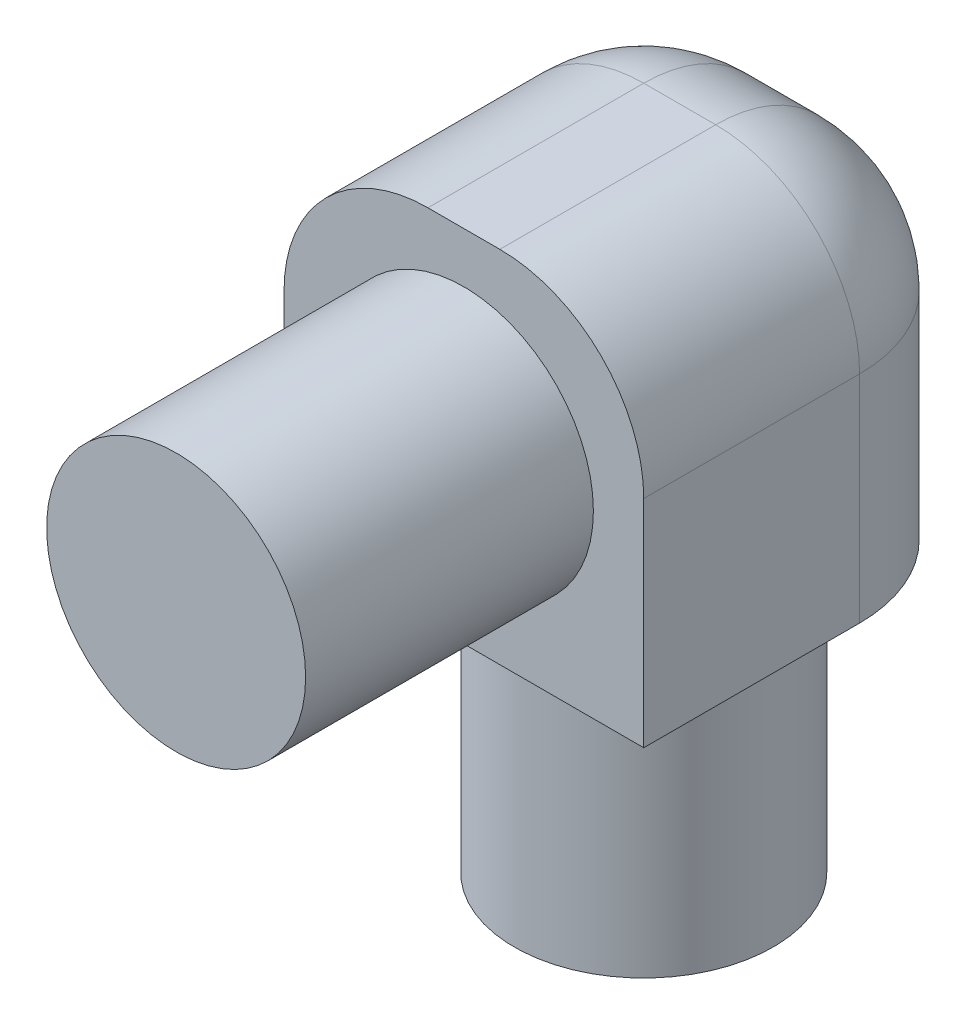
ISO-10303-21;
HEADER;
FILE_DESCRIPTION(('STEP AP214'),'2;1');
FILE_NAME('part.step','',(''),(''),'','','');
FILE_SCHEMA(('AUTOMOTIVE_DESIGN { 1 0 10303 214 1 1 1 1 }'));
ENDSEC;
DATA;
#1=APPLICATION_CONTEXT('core data for automotive mechanical design processes');
#2=APPLICATION_PROTOCOL_DEFINITION('international standard','automotive_design',2000,#1);
#3=PRODUCT_CONTEXT('',#1,'mechanical');
#4=PRODUCT('Part','Part','',(#3));
#5=PRODUCT_RELATED_PRODUCT_CATEGORY('part','',(#4));
#6=PRODUCT_DEFINITION_FORMATION('','',#4);
#7=PRODUCT_DEFINITION_CONTEXT('part definition',#1,'design');
#8=PRODUCT_DEFINITION('design','',#6,#7);
#9=PRODUCT_DEFINITION_SHAPE('','',#8);
#10=(LENGTH_UNIT() NAMED_UNIT(*) SI_UNIT(.MILLI.,.METRE.));
#11=(NAMED_UNIT(*) PLANE_ANGLE_UNIT() SI_UNIT($,.RADIAN.));
#12=(NAMED_UNIT(*) SI_UNIT($,.STERADIAN.) SOLID_ANGLE_UNIT());
#13=UNCERTAINTY_MEASURE_WITH_UNIT(LENGTH_MEASURE(1.E-05),#10,'distance_accuracy_value','');
#14=(GEOMETRIC_REPRESENTATION_CONTEXT(3) GLOBAL_UNCERTAINTY_ASSIGNED_CONTEXT((#13)) GLOBAL_UNIT_ASSIGNED_CONTEXT((#10,
#11,#12)) REPRESENTATION_CONTEXT('',''));
#15=CARTESIAN_POINT('',(0.,0.,0.));
#16=DIRECTION('',(0.,0.,1.));
#17=DIRECTION('',(1.,0.,0.));
#18=AXIS2_PLACEMENT_3D('',#15,#16,#17);
#19=CARTESIAN_POINT('',(-25.,50.,-25.));
#20=DIRECTION('',(1.,0.,0.));
#21=DIRECTION('',(0.,0.,-1.));
#22=AXIS2_PLACEMENT_3D('',#19,#20,#21);
#23=PLANE('',#22);
#24=DIRECTION('',(0.,0.,1.));
#25=VECTOR('',#24,1.);
#26=CARTESIAN_POINT('',(-25.,30.,-25.));
#27=LINE('',#26,#25);
#28=CARTESIAN_POINT('',(-25.,30.,25.));
#29=VERTEX_POINT('',#28);
#30=CARTESIAN_POINT('',(-25.,30.,-5.));
#31=VERTEX_POINT('',#30);
#32=EDGE_CURVE('E49',#29,#31,#27,.F.);
#33=ORIENTED_EDGE('',*,*,#32,.T.);
#34=DIRECTION('',(0.,-1.,0.));
#35=VECTOR('',#34,1.);
#36=CARTESIAN_POINT('',(-25.,50.,-5.));
#37=LINE('',#36,#35);
#38=CARTESIAN_POINT('',(-25.,0.,-5.));
#39=VERTEX_POINT('',#38);
#40=EDGE_CURVE('E11',#31,#39,#37,.T.);
#41=ORIENTED_EDGE('',*,*,#40,.T.);
#42=DIRECTION('',(0.,0.,1.));
#43=VECTOR('',#42,1.);
#44=CARTESIAN_POINT('',(-25.,0.,-25.));
#45=LINE('',#44,#43);
#46=CARTESIAN_POINT('',(-25.,0.,25.));
#47=VERTEX_POINT('',#46);
#48=EDGE_CURVE('E116',#39,#47,#45,.T.);
#49=ORIENTED_EDGE('',*,*,#48,.T.);
#50=DIRECTION('',(0.,-1.,0.));
#51=VECTOR('',#50,1.);
#52=CARTESIAN_POINT('',(-25.,50.,25.));
#53=LINE('',#52,#51);
#54=EDGE_CURVE('E104',#29,#47,#53,.T.);
#55=ORIENTED_EDGE('',*,*,#54,.F.);
#56=EDGE_LOOP('',(#33,#41,#49,#55));
#57=FACE_BOUND('',#56,.T.);
#58=ADVANCED_FACE('F39',(#57),#23,.F.);
#59=CARTESIAN_POINT('',(-25.,50.,25.));
#60=DIRECTION('',(0.,0.,-1.));
#61=DIRECTION('',(-1.,0.,0.));
#62=AXIS2_PLACEMENT_3D('',#59,#60,#61);
#63=PLANE('',#62);
#64=CARTESIAN_POINT('',(0.,25.,25.));
#65=DIRECTION('',(0.,0.,1.));
#66=DIRECTION('',(1.,0.,0.));
#67=AXIS2_PLACEMENT_3D('',#64,#65,#66);
#68=CIRCLE('',#67,18.);
#69=CARTESIAN_POINT('',(18.,25.,25.));
#70=VERTEX_POINT('',#69);
#71=EDGE_CURVE('E112',#70,#70,#68,.T.);
#72=ORIENTED_EDGE('',*,*,#71,.F.);
#73=EDGE_LOOP('',(#72));
#74=FACE_BOUND('',#73,.T.);
#75=DIRECTION('',(0.,-1.,0.));
#76=VECTOR('',#75,1.);
#77=CARTESIAN_POINT('',(25.,50.,25.));
#78=LINE('',#77,#76);
#79=CARTESIAN_POINT('',(25.,30.,25.));
#80=VERTEX_POINT('',#79);
#81=CARTESIAN_POINT('',(25.,0.,25.));
#82=VERTEX_POINT('',#81);
#83=EDGE_CURVE('E113',#80,#82,#78,.T.);
#84=ORIENTED_EDGE('',*,*,#83,.F.);
#85=CARTESIAN_POINT('',(5.,30.,25.));
#86=DIRECTION('',(0.,0.,-1.));
#87=DIRECTION('',(-1.,0.,0.));
#88=AXIS2_PLACEMENT_3D('',#85,#86,#87);
#89=CIRCLE('',#88,20.);
#90=CARTESIAN_POINT('',(5.,50.,25.));
#91=VERTEX_POINT('',#90);
#92=EDGE_CURVE('E173',#80,#91,#89,.F.);
#93=ORIENTED_EDGE('',*,*,#92,.T.);
#94=DIRECTION('',(1.,0.,0.));
#95=VECTOR('',#94,1.);
#96=CARTESIAN_POINT('',(-25.,50.,25.));
#97=LINE('',#96,#95);
#98=CARTESIAN_POINT('',(-5.,50.,25.));
#99=VERTEX_POINT('',#98);
#100=EDGE_CURVE('E136',#99,#91,#97,.T.);
#101=ORIENTED_EDGE('',*,*,#100,.F.);
#102=CARTESIAN_POINT('',(-5.,30.,25.));
#103=DIRECTION('',(0.,0.,-1.));
#104=DIRECTION('',(-1.,0.,0.));
#105=AXIS2_PLACEMENT_3D('',#102,#103,#104);
#106=CIRCLE('',#105,20.);
#107=EDGE_CURVE('E63',#99,#29,#106,.F.);
#108=ORIENTED_EDGE('',*,*,#107,.T.);
#109=ORIENTED_EDGE('',*,*,#54,.T.);
#110=DIRECTION('',(1.,0.,0.));
#111=VECTOR('',#110,1.);
#112=CARTESIAN_POINT('',(-25.,0.,25.));
#113=LINE('',#112,#111);
#114=EDGE_CURVE('E109',#47,#82,#113,.T.);
#115=ORIENTED_EDGE('',*,*,#114,.T.);
#116=EDGE_LOOP('',(#84,#93,#101,#108,#109,#115));
#117=FACE_BOUND('',#116,.T.);
#118=ADVANCED_FACE('F107',(#74,#117),#63,.F.);
#119=CARTESIAN_POINT('',(25.,50.,-25.));
#120=DIRECTION('',(-1.,0.,0.));
#121=DIRECTION('',(0.,0.,1.));
#122=AXIS2_PLACEMENT_3D('',#119,#120,#121);
#123=PLANE('',#122);
#124=DIRECTION('',(0.,0.,-1.));
#125=VECTOR('',#124,1.);
#126=CARTESIAN_POINT('',(25.,0.,-25.));
#127=LINE('',#126,#125);
#128=CARTESIAN_POINT('',(25.,0.,-5.));
#129=VERTEX_POINT('',#128);
#130=EDGE_CURVE('E125',#82,#129,#127,.T.);
#131=ORIENTED_EDGE('',*,*,#130,.T.);
#132=DIRECTION('',(0.,-1.,0.));
#133=VECTOR('',#132,1.);
#134=CARTESIAN_POINT('',(25.,50.,-5.));
#135=LINE('',#134,#133);
#136=CARTESIAN_POINT('',(25.,30.,-5.));
#137=VERTEX_POINT('',#136);
#138=EDGE_CURVE('E168',#129,#137,#135,.F.);
#139=ORIENTED_EDGE('',*,*,#138,.T.);
#140=DIRECTION('',(0.,0.,-1.));
#141=VECTOR('',#140,1.);
#142=CARTESIAN_POINT('',(25.,30.,25.));
#143=LINE('',#142,#141);
#144=EDGE_CURVE('E165',#137,#80,#143,.F.);
#145=ORIENTED_EDGE('',*,*,#144,.T.);
#146=ORIENTED_EDGE('',*,*,#83,.T.);
#147=EDGE_LOOP('',(#131,#139,#145,#146));
#148=FACE_BOUND('',#147,.T.);
#149=ADVANCED_FACE('F252',(#148),#123,.F.);
#150=CARTESIAN_POINT('',(-25.,50.,-25.));
#151=DIRECTION('',(0.,0.,1.));
#152=DIRECTION('',(1.,0.,0.));
#153=AXIS2_PLACEMENT_3D('',#150,#151,#152);
#154=PLANE('',#153);
#155=DIRECTION('',(-1.,0.,0.));
#156=VECTOR('',#155,1.);
#157=CARTESIAN_POINT('',(25.,30.,-25.));
#158=LINE('',#157,#156);
#159=CARTESIAN_POINT('',(-5.,30.,-25.));
#160=VERTEX_POINT('',#159);
#161=CARTESIAN_POINT('',(5.,30.,-25.));
#162=VERTEX_POINT('',#161);
#163=EDGE_CURVE('E153',#160,#162,#158,.F.);
#164=ORIENTED_EDGE('',*,*,#163,.T.);
#165=DIRECTION('',(0.,-1.,0.));
#166=VECTOR('',#165,1.);
#167=CARTESIAN_POINT('',(5.,50.,-25.));
#168=LINE('',#167,#166);
#169=CARTESIAN_POINT('',(5.,0.,-25.));
#170=VERTEX_POINT('',#169);
#171=EDGE_CURVE('E156',#162,#170,#168,.T.);
#172=ORIENTED_EDGE('',*,*,#171,.T.);
#173=DIRECTION('',(-1.,0.,0.));
#174=VECTOR('',#173,1.);
#175=CARTESIAN_POINT('',(-25.,0.,-25.));
#176=LINE('',#175,#174);
#177=CARTESIAN_POINT('',(-5.,0.,-25.));
#178=VERTEX_POINT('',#177);
#179=EDGE_CURVE('E129',#170,#178,#176,.T.);
#180=ORIENTED_EDGE('',*,*,#179,.T.);
#181=DIRECTION('',(0.,-1.,0.));
#182=VECTOR('',#181,1.);
#183=CARTESIAN_POINT('',(-5.,50.,-25.));
#184=LINE('',#183,#182);
#185=EDGE_CURVE('E150',#178,#160,#184,.F.);
#186=ORIENTED_EDGE('',*,*,#185,.T.);
#187=EDGE_LOOP('',(#164,#172,#180,#186));
#188=FACE_BOUND('',#187,.T.);
#189=ADVANCED_FACE('F351',(#188),#154,.F.);
#190=CARTESIAN_POINT('',(0.,50.,0.));
#191=DIRECTION('',(0.,1.,0.));
#192=DIRECTION('',(0.,0.,1.));
#193=AXIS2_PLACEMENT_3D('',#190,#191,#192);
#194=PLANE('',#193);
#195=ORIENTED_EDGE('',*,*,#100,.T.);
#196=DIRECTION('',(0.,0.,-1.));
#197=VECTOR('',#196,1.);
#198=CARTESIAN_POINT('',(5.,50.,-25.));
#199=LINE('',#198,#197);
#200=CARTESIAN_POINT('',(5.,50.,-5.));
#201=VERTEX_POINT('',#200);
#202=EDGE_CURVE('E147',#91,#201,#199,.T.);
#203=ORIENTED_EDGE('',*,*,#202,.T.);
#204=DIRECTION('',(-1.,0.,0.));
#205=VECTOR('',#204,1.);
#206=CARTESIAN_POINT('',(-25.,50.,-5.));
#207=LINE('',#206,#205);
#208=CARTESIAN_POINT('',(-5.,50.,-5.));
#209=VERTEX_POINT('',#208);
#210=EDGE_CURVE('E142',#201,#209,#207,.T.);
#211=ORIENTED_EDGE('',*,*,#210,.T.);
#212=DIRECTION('',(0.,0.,1.));
#213=VECTOR('',#212,1.);
#214=CARTESIAN_POINT('',(-5.,50.,25.));
#215=LINE('',#214,#213);
#216=EDGE_CURVE('E139',#209,#99,#215,.T.);
#217=ORIENTED_EDGE('',*,*,#216,.T.);
#218=EDGE_LOOP('',(#195,#203,#211,#217));
#219=FACE_BOUND('',#218,.T.);
#220=ADVANCED_FACE('F220',(#219),#194,.T.);
#221=CARTESIAN_POINT('',(0.,0.,0.));
#222=DIRECTION('',(0.,1.,0.));
#223=DIRECTION('',(0.,0.,1.));
#224=AXIS2_PLACEMENT_3D('',#221,#222,#223);
#225=PLANE('',#224);
#226=CARTESIAN_POINT('',(0.,0.,0.));
#227=DIRECTION('',(0.,-1.,0.));
#228=DIRECTION('',(0.,0.,-1.));
#229=AXIS2_PLACEMENT_3D('',#226,#227,#228);
#230=CIRCLE('',#229,18.);
#231=CARTESIAN_POINT('',(0.,0.,-18.));
#232=VERTEX_POINT('',#231);
#233=EDGE_CURVE('E143',#232,#232,#230,.T.);
#234=ORIENTED_EDGE('',*,*,#233,.F.);
#235=EDGE_LOOP('',(#234));
#236=FACE_BOUND('',#235,.T.);
#237=ORIENTED_EDGE('',*,*,#179,.F.);
#238=CARTESIAN_POINT('',(5.,0.,-5.));
#239=DIRECTION('',(0.,1.,0.));
#240=DIRECTION('',(0.,0.,1.));
#241=AXIS2_PLACEMENT_3D('',#238,#239,#240);
#242=CIRCLE('',#241,20.);
#243=EDGE_CURVE('E162',#170,#129,#242,.F.);
#244=ORIENTED_EDGE('',*,*,#243,.T.);
#245=ORIENTED_EDGE('',*,*,#130,.F.);
#246=ORIENTED_EDGE('',*,*,#114,.F.);
#247=ORIENTED_EDGE('',*,*,#48,.F.);
#248=CARTESIAN_POINT('',(-5.,0.,-5.));
#249=DIRECTION('',(0.,1.,0.));
#250=DIRECTION('',(0.,0.,1.));
#251=AXIS2_PLACEMENT_3D('',#248,#249,#250);
#252=CIRCLE('',#251,20.);
#253=EDGE_CURVE('E159',#39,#178,#252,.F.);
#254=ORIENTED_EDGE('',*,*,#253,.T.);
#255=EDGE_LOOP('',(#237,#244,#245,#246,#247,#254));
#256=FACE_BOUND('',#255,.T.);
#257=ADVANCED_FACE('F123',(#236,#256),#225,.F.);
#258=CARTESIAN_POINT('',(0.,25.,65.));
#259=DIRECTION('',(0.,0.,-1.));
#260=DIRECTION('',(-1.,0.,0.));
#261=AXIS2_PLACEMENT_3D('',#258,#259,#260);
#262=CYLINDRICAL_SURFACE('',#261,18.);
#263=CARTESIAN_POINT('',(0.,25.,65.));
#264=DIRECTION('',(0.,0.,1.));
#265=DIRECTION('',(1.,0.,0.));
#266=AXIS2_PLACEMENT_3D('',#263,#264,#265);
#267=CIRCLE('',#266,18.);
#268=CARTESIAN_POINT('',(18.,25.,65.));
#269=VERTEX_POINT('',#268);
#270=EDGE_CURVE('E120',#269,#269,#267,.T.);
#271=ORIENTED_EDGE('',*,*,#270,.F.);
#272=EDGE_LOOP('',(#271));
#273=FACE_BOUND('',#272,.T.);
#274=ORIENTED_EDGE('',*,*,#71,.T.);
#275=EDGE_LOOP('',(#274));
#276=FACE_BOUND('',#275,.T.);
#277=ADVANCED_FACE('F327',(#273,#276),#262,.T.);
#278=CARTESIAN_POINT('',(0.,25.,65.));
#279=DIRECTION('',(0.,0.,1.));
#280=DIRECTION('',(1.,0.,0.));
#281=AXIS2_PLACEMENT_3D('',#278,#279,#280);
#282=PLANE('',#281);
#283=ORIENTED_EDGE('',*,*,#270,.T.);
#284=EDGE_LOOP('',(#283));
#285=FACE_BOUND('',#284,.T.);
#286=ADVANCED_FACE('F318',(#285),#282,.T.);
#287=CARTESIAN_POINT('',(0.,-40.,0.));
#288=DIRECTION('',(0.,1.,0.));
#289=DIRECTION('',(0.,0.,1.));
#290=AXIS2_PLACEMENT_3D('',#287,#288,#289);
#291=CYLINDRICAL_SURFACE('',#290,18.);
#292=CARTESIAN_POINT('',(0.,-40.,0.));
#293=DIRECTION('',(0.,-1.,0.));
#294=DIRECTION('',(0.,0.,-1.));
#295=AXIS2_PLACEMENT_3D('',#292,#293,#294);
#296=CIRCLE('',#295,18.);
#297=CARTESIAN_POINT('',(0.,-40.,-18.));
#298=VERTEX_POINT('',#297);
#299=EDGE_CURVE('E200',#298,#298,#296,.T.);
#300=ORIENTED_EDGE('',*,*,#299,.F.);
#301=EDGE_LOOP('',(#300));
#302=FACE_BOUND('',#301,.T.);
#303=ORIENTED_EDGE('',*,*,#233,.T.);
#304=EDGE_LOOP('',(#303));
#305=FACE_BOUND('',#304,.T.);
#306=ADVANCED_FACE('F310',(#302,#305),#291,.T.);
#307=CARTESIAN_POINT('',(0.,-40.,0.));
#308=DIRECTION('',(0.,-1.,0.));
#309=DIRECTION('',(0.,0.,-1.));
#310=AXIS2_PLACEMENT_3D('',#307,#308,#309);
#311=PLANE('',#310);
#312=ORIENTED_EDGE('',*,*,#299,.T.);
#313=EDGE_LOOP('',(#312));
#314=FACE_BOUND('',#313,.T.);
#315=ADVANCED_FACE('F301',(#314),#311,.T.);
#316=CARTESIAN_POINT('',(5.,50.,-5.));
#317=DIRECTION('',(0.,-1.,0.));
#318=DIRECTION('',(0.,0.,-1.));
#319=AXIS2_PLACEMENT_3D('',#316,#317,#318);
#320=CYLINDRICAL_SURFACE('',#319,20.);
#321=ORIENTED_EDGE('',*,*,#243,.F.);
#322=ORIENTED_EDGE('',*,*,#171,.F.);
#323=CARTESIAN_POINT('',(5.,30.,-5.));
#324=DIRECTION('',(0.,1.,0.));
#325=DIRECTION('',(0.,0.,1.));
#326=AXIS2_PLACEMENT_3D('',#323,#324,#325);
#327=CIRCLE('',#326,20.);
#328=EDGE_CURVE('E43',#137,#162,#327,.T.);
#329=ORIENTED_EDGE('',*,*,#328,.F.);
#330=ORIENTED_EDGE('',*,*,#138,.F.);
#331=EDGE_LOOP('',(#321,#322,#329,#330));
#332=FACE_BOUND('',#331,.T.);
#333=ADVANCED_FACE('F41',(#332),#320,.T.);
#334=CARTESIAN_POINT('',(5.,30.,0.));
#335=DIRECTION('',(0.,0.,1.));
#336=DIRECTION('',(1.,0.,0.));
#337=AXIS2_PLACEMENT_3D('',#334,#335,#336);
#338=CYLINDRICAL_SURFACE('',#337,20.);
#339=ORIENTED_EDGE('',*,*,#92,.F.);
#340=ORIENTED_EDGE('',*,*,#144,.F.);
#341=CARTESIAN_POINT('',(5.,30.,-5.));
#342=DIRECTION('',(0.,0.,-1.));
#343=DIRECTION('',(-1.,0.,0.));
#344=AXIS2_PLACEMENT_3D('',#341,#342,#343);
#345=CIRCLE('',#344,20.);
#346=EDGE_CURVE('E192',#201,#137,#345,.T.);
#347=ORIENTED_EDGE('',*,*,#346,.F.);
#348=ORIENTED_EDGE('',*,*,#202,.F.);
#349=EDGE_LOOP('',(#339,#340,#347,#348));
#350=FACE_BOUND('',#349,.T.);
#351=ADVANCED_FACE('F224',(#350),#338,.T.);
#352=CARTESIAN_POINT('',(-5.,30.,0.));
#353=DIRECTION('',(0.,0.,-1.));
#354=DIRECTION('',(-1.,0.,0.));
#355=AXIS2_PLACEMENT_3D('',#352,#353,#354);
#356=CYLINDRICAL_SURFACE('',#355,20.);
#357=ORIENTED_EDGE('',*,*,#107,.F.);
#358=ORIENTED_EDGE('',*,*,#216,.F.);
#359=CARTESIAN_POINT('',(-5.,30.,-5.));
#360=DIRECTION('',(0.,0.,-1.));
#361=DIRECTION('',(-1.,0.,0.));
#362=AXIS2_PLACEMENT_3D('',#359,#360,#361);
#363=CIRCLE('',#362,20.);
#364=EDGE_CURVE('E189',#31,#209,#363,.T.);
#365=ORIENTED_EDGE('',*,*,#364,.F.);
#366=ORIENTED_EDGE('',*,*,#32,.F.);
#367=EDGE_LOOP('',(#357,#358,#365,#366));
#368=FACE_BOUND('',#367,.T.);
#369=ADVANCED_FACE('F237',(#368),#356,.T.);
#370=CARTESIAN_POINT('',(-5.,50.,-5.));
#371=DIRECTION('',(0.,-1.,0.));
#372=DIRECTION('',(0.,0.,-1.));
#373=AXIS2_PLACEMENT_3D('',#370,#371,#372);
#374=CYLINDRICAL_SURFACE('',#373,20.);
#375=ORIENTED_EDGE('',*,*,#253,.F.);
#376=ORIENTED_EDGE('',*,*,#40,.F.);
#377=CARTESIAN_POINT('',(-5.,30.,-5.));
#378=DIRECTION('',(0.,1.,0.));
#379=DIRECTION('',(0.,0.,1.));
#380=AXIS2_PLACEMENT_3D('',#377,#378,#379);
#381=CIRCLE('',#380,20.);
#382=EDGE_CURVE('E185',#160,#31,#381,.T.);
#383=ORIENTED_EDGE('',*,*,#382,.F.);
#384=ORIENTED_EDGE('',*,*,#185,.F.);
#385=EDGE_LOOP('',(#375,#376,#383,#384));
#386=FACE_BOUND('',#385,.T.);
#387=ADVANCED_FACE('F239',(#386),#374,.T.);
#388=CARTESIAN_POINT('',(5.,30.,-5.));
#389=DIRECTION('',(1.,0.,0.));
#390=DIRECTION('',(0.,0.,-1.));
#391=AXIS2_PLACEMENT_3D('',#388,#389,#390);
#392=SPHERICAL_SURFACE('',#391,20.);
#393=ORIENTED_EDGE('',*,*,#346,.T.);
#394=ORIENTED_EDGE('',*,*,#328,.T.);
#395=CARTESIAN_POINT('',(5.,30.,-5.));
#396=DIRECTION('',(1.,0.,0.));
#397=DIRECTION('',(0.,0.,-1.));
#398=AXIS2_PLACEMENT_3D('',#395,#396,#397);
#399=CIRCLE('',#398,20.);
#400=EDGE_CURVE('E181',#201,#162,#399,.F.);
#401=ORIENTED_EDGE('',*,*,#400,.F.);
#402=EDGE_LOOP('',(#393,#394,#401));
#403=FACE_BOUND('',#402,.T.);
#404=ADVANCED_FACE('F227',(#403),#392,.T.);
#405=CARTESIAN_POINT('',(-5.,30.,-5.));
#406=DIRECTION('',(-1.,0.,0.));
#407=DIRECTION('',(0.,0.,1.));
#408=AXIS2_PLACEMENT_3D('',#405,#406,#407);
#409=SPHERICAL_SURFACE('',#408,20.);
#410=ORIENTED_EDGE('',*,*,#382,.T.);
#411=ORIENTED_EDGE('',*,*,#364,.T.);
#412=CARTESIAN_POINT('',(-5.,30.,-5.));
#413=DIRECTION('',(-1.,0.,0.));
#414=DIRECTION('',(0.,0.,1.));
#415=AXIS2_PLACEMENT_3D('',#412,#413,#414);
#416=CIRCLE('',#415,20.);
#417=EDGE_CURVE('E178',#160,#209,#416,.F.);
#418=ORIENTED_EDGE('',*,*,#417,.F.);
#419=EDGE_LOOP('',(#410,#411,#418));
#420=FACE_BOUND('',#419,.T.);
#421=ADVANCED_FACE('F234',(#420),#409,.T.);
#422=CARTESIAN_POINT('',(0.,30.,-5.));
#423=DIRECTION('',(1.,0.,0.));
#424=DIRECTION('',(0.,0.,-1.));
#425=AXIS2_PLACEMENT_3D('',#422,#423,#424);
#426=CYLINDRICAL_SURFACE('',#425,20.);
#427=ORIENTED_EDGE('',*,*,#400,.T.);
#428=ORIENTED_EDGE('',*,*,#163,.F.);
#429=ORIENTED_EDGE('',*,*,#417,.T.);
#430=ORIENTED_EDGE('',*,*,#210,.F.);
#431=EDGE_LOOP('',(#427,#428,#429,#430));
#432=FACE_BOUND('',#431,.T.);
#433=ADVANCED_FACE('F230',(#432),#426,.T.);
#434=CLOSED_SHELL('',(#58,#118,#149,#189,#220,#257,#277,#286,#306,#315,#333,#351,#369,#387,#404,
#421,#433));
#435=MANIFOLD_SOLID_BREP('B2',#434);
#436=ADVANCED_BREP_SHAPE_REPRESENTATION('',(#18,#435),#14);
#437=SHAPE_DEFINITION_REPRESENTATION(#9,#436);
ENDSEC;
END-ISO-10303-21;
